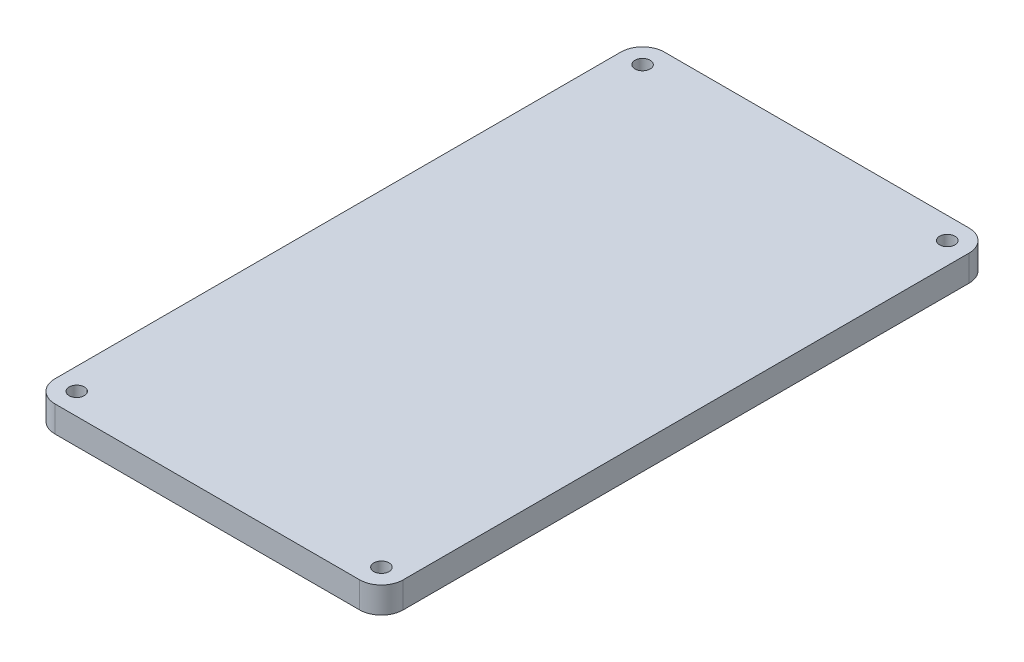
ISO-10303-21;
HEADER;
FILE_DESCRIPTION(('STEP AP214'),'2;1');
FILE_NAME('part.step','',(''),(''),'','','');
FILE_SCHEMA(('AUTOMOTIVE_DESIGN { 1 0 10303 214 1 1 1 1 }'));
ENDSEC;
DATA;
#1=APPLICATION_CONTEXT('core data for automotive mechanical design processes');
#2=APPLICATION_PROTOCOL_DEFINITION('international standard','automotive_design',2000,#1);
#3=PRODUCT_CONTEXT('',#1,'mechanical');
#4=PRODUCT('Part','Part','',(#3));
#5=PRODUCT_RELATED_PRODUCT_CATEGORY('part','',(#4));
#6=PRODUCT_DEFINITION_FORMATION('','',#4);
#7=PRODUCT_DEFINITION_CONTEXT('part definition',#1,'design');
#8=PRODUCT_DEFINITION('design','',#6,#7);
#9=PRODUCT_DEFINITION_SHAPE('','',#8);
#10=(LENGTH_UNIT() NAMED_UNIT(*) SI_UNIT(.MILLI.,.METRE.));
#11=(NAMED_UNIT(*) PLANE_ANGLE_UNIT() SI_UNIT($,.RADIAN.));
#12=(NAMED_UNIT(*) SI_UNIT($,.STERADIAN.) SOLID_ANGLE_UNIT());
#13=UNCERTAINTY_MEASURE_WITH_UNIT(LENGTH_MEASURE(1.E-05),#10,'distance_accuracy_value','');
#14=(GEOMETRIC_REPRESENTATION_CONTEXT(3) GLOBAL_UNCERTAINTY_ASSIGNED_CONTEXT((#13)) GLOBAL_UNIT_ASSIGNED_CONTEXT((#10,
#11,#12)) REPRESENTATION_CONTEXT('',''));
#15=CARTESIAN_POINT('',(0.,0.,0.));
#16=DIRECTION('',(0.,0.,1.));
#17=DIRECTION('',(1.,0.,0.));
#18=AXIS2_PLACEMENT_3D('',#15,#16,#17);
#19=CARTESIAN_POINT('',(40.,6.,-70.));
#20=DIRECTION('',(-1.,0.,0.));
#21=DIRECTION('',(0.,0.,1.));
#22=AXIS2_PLACEMENT_3D('',#19,#20,#21);
#23=PLANE('',#22);
#24=DIRECTION('',(0.,0.,-1.));
#25=VECTOR('',#24,1.);
#26=CARTESIAN_POINT('',(40.,0.,-70.));
#27=LINE('',#26,#25);
#28=CARTESIAN_POINT('',(40.,0.,65.));
#29=VERTEX_POINT('',#28);
#30=CARTESIAN_POINT('',(40.,0.,-65.));
#31=VERTEX_POINT('',#30);
#32=EDGE_CURVE('E130',#29,#31,#27,.T.);
#33=ORIENTED_EDGE('',*,*,#32,.T.);
#34=DIRECTION('',(0.,-1.,0.));
#35=VECTOR('',#34,1.);
#36=CARTESIAN_POINT('',(40.,6.,-65.));
#37=LINE('',#36,#35);
#38=CARTESIAN_POINT('',(40.,6.,-65.));
#39=VERTEX_POINT('',#38);
#40=EDGE_CURVE('E152',#31,#39,#37,.F.);
#41=ORIENTED_EDGE('',*,*,#40,.T.);
#42=DIRECTION('',(0.,0.,-1.));
#43=VECTOR('',#42,1.);
#44=CARTESIAN_POINT('',(40.,6.,-70.));
#45=LINE('',#44,#43);
#46=CARTESIAN_POINT('',(40.,6.,65.));
#47=VERTEX_POINT('',#46);
#48=EDGE_CURVE('E128',#47,#39,#45,.T.);
#49=ORIENTED_EDGE('',*,*,#48,.F.);
#50=DIRECTION('',(0.,-1.,0.));
#51=VECTOR('',#50,1.);
#52=CARTESIAN_POINT('',(40.,6.,65.));
#53=LINE('',#52,#51);
#54=EDGE_CURVE('E149',#47,#29,#53,.T.);
#55=ORIENTED_EDGE('',*,*,#54,.T.);
#56=EDGE_LOOP('',(#33,#41,#49,#55));
#57=FACE_BOUND('',#56,.T.);
#58=ADVANCED_FACE('F33',(#57),#23,.F.);
#59=CARTESIAN_POINT('',(-40.,6.,-70.));
#60=DIRECTION('',(0.,0.,1.));
#61=DIRECTION('',(1.,0.,0.));
#62=AXIS2_PLACEMENT_3D('',#59,#60,#61);
#63=PLANE('',#62);
#64=DIRECTION('',(-1.,0.,0.));
#65=VECTOR('',#64,1.);
#66=CARTESIAN_POINT('',(-40.,0.,-70.));
#67=LINE('',#66,#65);
#68=CARTESIAN_POINT('',(35.,0.,-70.));
#69=VERTEX_POINT('',#68);
#70=CARTESIAN_POINT('',(-35.,0.,-70.));
#71=VERTEX_POINT('',#70);
#72=EDGE_CURVE('E126',#69,#71,#67,.T.);
#73=ORIENTED_EDGE('',*,*,#72,.T.);
#74=DIRECTION('',(0.,-1.,0.));
#75=VECTOR('',#74,1.);
#76=CARTESIAN_POINT('',(-35.,6.,-70.));
#77=LINE('',#76,#75);
#78=CARTESIAN_POINT('',(-35.,6.,-70.));
#79=VERTEX_POINT('',#78);
#80=EDGE_CURVE('E104',#71,#79,#77,.F.);
#81=ORIENTED_EDGE('',*,*,#80,.T.);
#82=DIRECTION('',(-1.,0.,0.));
#83=VECTOR('',#82,1.);
#84=CARTESIAN_POINT('',(-40.,6.,-70.));
#85=LINE('',#84,#83);
#86=CARTESIAN_POINT('',(35.,6.,-70.));
#87=VERTEX_POINT('',#86);
#88=EDGE_CURVE('E166',#87,#79,#85,.T.);
#89=ORIENTED_EDGE('',*,*,#88,.F.);
#90=DIRECTION('',(0.,-1.,0.));
#91=VECTOR('',#90,1.);
#92=CARTESIAN_POINT('',(35.,6.,-70.));
#93=LINE('',#92,#91);
#94=EDGE_CURVE('E109',#87,#69,#93,.T.);
#95=ORIENTED_EDGE('',*,*,#94,.T.);
#96=EDGE_LOOP('',(#73,#81,#89,#95));
#97=FACE_BOUND('',#96,.T.);
#98=ADVANCED_FACE('F171',(#97),#63,.F.);
#99=CARTESIAN_POINT('',(-40.,6.,-70.));
#100=DIRECTION('',(1.,0.,0.));
#101=DIRECTION('',(0.,0.,-1.));
#102=AXIS2_PLACEMENT_3D('',#99,#100,#101);
#103=PLANE('',#102);
#104=DIRECTION('',(0.,0.,1.));
#105=VECTOR('',#104,1.);
#106=CARTESIAN_POINT('',(-40.,6.,-70.));
#107=LINE('',#106,#105);
#108=CARTESIAN_POINT('',(-40.,6.,-65.));
#109=VERTEX_POINT('',#108);
#110=CARTESIAN_POINT('',(-40.,6.,65.));
#111=VERTEX_POINT('',#110);
#112=EDGE_CURVE('E118',#109,#111,#107,.T.);
#113=ORIENTED_EDGE('',*,*,#112,.F.);
#114=DIRECTION('',(0.,-1.,0.));
#115=VECTOR('',#114,1.);
#116=CARTESIAN_POINT('',(-40.,6.,-65.));
#117=LINE('',#116,#115);
#118=CARTESIAN_POINT('',(-40.,0.,-65.));
#119=VERTEX_POINT('',#118);
#120=EDGE_CURVE('E103',#109,#119,#117,.T.);
#121=ORIENTED_EDGE('',*,*,#120,.T.);
#122=DIRECTION('',(0.,0.,1.));
#123=VECTOR('',#122,1.);
#124=CARTESIAN_POINT('',(-40.,0.,-70.));
#125=LINE('',#124,#123);
#126=CARTESIAN_POINT('',(-40.,0.,65.));
#127=VERTEX_POINT('',#126);
#128=EDGE_CURVE('E116',#119,#127,#125,.T.);
#129=ORIENTED_EDGE('',*,*,#128,.T.);
#130=DIRECTION('',(0.,-1.,0.));
#131=VECTOR('',#130,1.);
#132=CARTESIAN_POINT('',(-40.,6.,65.));
#133=LINE('',#132,#131);
#134=EDGE_CURVE('E120',#127,#111,#133,.F.);
#135=ORIENTED_EDGE('',*,*,#134,.T.);
#136=EDGE_LOOP('',(#113,#121,#129,#135));
#137=FACE_BOUND('',#136,.T.);
#138=ADVANCED_FACE('F115',(#137),#103,.F.);
#139=CARTESIAN_POINT('',(-40.,6.,70.));
#140=DIRECTION('',(0.,0.,-1.));
#141=DIRECTION('',(-1.,0.,0.));
#142=AXIS2_PLACEMENT_3D('',#139,#140,#141);
#143=PLANE('',#142);
#144=DIRECTION('',(1.,0.,0.));
#145=VECTOR('',#144,1.);
#146=CARTESIAN_POINT('',(-40.,6.,70.));
#147=LINE('',#146,#145);
#148=CARTESIAN_POINT('',(-35.,6.,70.));
#149=VERTEX_POINT('',#148);
#150=CARTESIAN_POINT('',(35.,6.,70.));
#151=VERTEX_POINT('',#150);
#152=EDGE_CURVE('E134',#149,#151,#147,.T.);
#153=ORIENTED_EDGE('',*,*,#152,.F.);
#154=DIRECTION('',(0.,-1.,0.));
#155=VECTOR('',#154,1.);
#156=CARTESIAN_POINT('',(-35.,6.,70.));
#157=LINE('',#156,#155);
#158=CARTESIAN_POINT('',(-35.,0.,70.));
#159=VERTEX_POINT('',#158);
#160=EDGE_CURVE('E11',#149,#159,#157,.T.);
#161=ORIENTED_EDGE('',*,*,#160,.T.);
#162=DIRECTION('',(1.,0.,0.));
#163=VECTOR('',#162,1.);
#164=CARTESIAN_POINT('',(-40.,0.,70.));
#165=LINE('',#164,#163);
#166=CARTESIAN_POINT('',(35.,0.,70.));
#167=VERTEX_POINT('',#166);
#168=EDGE_CURVE('E125',#159,#167,#165,.T.);
#169=ORIENTED_EDGE('',*,*,#168,.T.);
#170=DIRECTION('',(0.,-1.,0.));
#171=VECTOR('',#170,1.);
#172=CARTESIAN_POINT('',(35.,6.,70.));
#173=LINE('',#172,#171);
#174=EDGE_CURVE('E41',#167,#151,#173,.F.);
#175=ORIENTED_EDGE('',*,*,#174,.T.);
#176=EDGE_LOOP('',(#153,#161,#169,#175));
#177=FACE_BOUND('',#176,.T.);
#178=ADVANCED_FACE('F213',(#177),#143,.F.);
#179=CARTESIAN_POINT('',(0.,6.,0.));
#180=DIRECTION('',(0.,1.,0.));
#181=DIRECTION('',(0.,0.,1.));
#182=AXIS2_PLACEMENT_3D('',#179,#180,#181);
#183=PLANE('',#182);
#184=CARTESIAN_POINT('',(35.,6.,-65.));
#185=DIRECTION('',(0.,1.,0.));
#186=DIRECTION('',(0.,0.,1.));
#187=AXIS2_PLACEMENT_3D('',#184,#185,#186);
#188=CIRCLE('',#187,1.75);
#189=CARTESIAN_POINT('',(35.,6.,-63.25));
#190=VERTEX_POINT('',#189);
#191=EDGE_CURVE('E190',#190,#190,#188,.T.);
#192=ORIENTED_EDGE('',*,*,#191,.F.);
#193=EDGE_LOOP('',(#192));
#194=FACE_BOUND('',#193,.T.);
#195=CARTESIAN_POINT('',(-35.,6.,65.));
#196=DIRECTION('',(0.,1.,0.));
#197=DIRECTION('',(0.,0.,1.));
#198=AXIS2_PLACEMENT_3D('',#195,#196,#197);
#199=CIRCLE('',#198,1.75);
#200=CARTESIAN_POINT('',(-35.,6.,66.75));
#201=VERTEX_POINT('',#200);
#202=EDGE_CURVE('E183',#201,#201,#199,.T.);
#203=ORIENTED_EDGE('',*,*,#202,.F.);
#204=EDGE_LOOP('',(#203));
#205=FACE_BOUND('',#204,.T.);
#206=CARTESIAN_POINT('',(35.,6.,65.));
#207=DIRECTION('',(0.,1.,0.));
#208=DIRECTION('',(0.,0.,1.));
#209=AXIS2_PLACEMENT_3D('',#206,#207,#208);
#210=CIRCLE('',#209,1.75);
#211=CARTESIAN_POINT('',(35.,6.,66.75));
#212=VERTEX_POINT('',#211);
#213=EDGE_CURVE('E195',#212,#212,#210,.T.);
#214=ORIENTED_EDGE('',*,*,#213,.F.);
#215=EDGE_LOOP('',(#214));
#216=FACE_BOUND('',#215,.T.);
#217=CARTESIAN_POINT('',(-35.,6.,-65.));
#218=DIRECTION('',(0.,1.,0.));
#219=DIRECTION('',(0.,0.,1.));
#220=AXIS2_PLACEMENT_3D('',#217,#218,#219);
#221=CIRCLE('',#220,1.75);
#222=CARTESIAN_POINT('',(-35.,6.,-63.25));
#223=VERTEX_POINT('',#222);
#224=EDGE_CURVE('E174',#223,#223,#221,.T.);
#225=ORIENTED_EDGE('',*,*,#224,.F.);
#226=EDGE_LOOP('',(#225));
#227=FACE_BOUND('',#226,.T.);
#228=ORIENTED_EDGE('',*,*,#88,.T.);
#229=CARTESIAN_POINT('',(-35.,6.,-65.));
#230=DIRECTION('',(0.,1.,0.));
#231=DIRECTION('',(0.,0.,1.));
#232=AXIS2_PLACEMENT_3D('',#229,#230,#231);
#233=CIRCLE('',#232,5.);
#234=EDGE_CURVE('E147',#79,#109,#233,.T.);
#235=ORIENTED_EDGE('',*,*,#234,.T.);
#236=ORIENTED_EDGE('',*,*,#112,.T.);
#237=CARTESIAN_POINT('',(-35.,6.,65.));
#238=DIRECTION('',(0.,1.,0.));
#239=DIRECTION('',(0.,0.,1.));
#240=AXIS2_PLACEMENT_3D('',#237,#238,#239);
#241=CIRCLE('',#240,5.);
#242=EDGE_CURVE('E54',#111,#149,#241,.T.);
#243=ORIENTED_EDGE('',*,*,#242,.T.);
#244=ORIENTED_EDGE('',*,*,#152,.T.);
#245=CARTESIAN_POINT('',(35.,6.,65.));
#246=DIRECTION('',(0.,1.,0.));
#247=DIRECTION('',(0.,0.,1.));
#248=AXIS2_PLACEMENT_3D('',#245,#246,#247);
#249=CIRCLE('',#248,5.);
#250=EDGE_CURVE('E142',#151,#47,#249,.T.);
#251=ORIENTED_EDGE('',*,*,#250,.T.);
#252=ORIENTED_EDGE('',*,*,#48,.T.);
#253=CARTESIAN_POINT('',(35.,6.,-65.));
#254=DIRECTION('',(0.,1.,0.));
#255=DIRECTION('',(0.,0.,1.));
#256=AXIS2_PLACEMENT_3D('',#253,#254,#255);
#257=CIRCLE('',#256,5.);
#258=EDGE_CURVE('E145',#39,#87,#257,.T.);
#259=ORIENTED_EDGE('',*,*,#258,.T.);
#260=EDGE_LOOP('',(#228,#235,#236,#243,#244,#251,#252,#259));
#261=FACE_BOUND('',#260,.T.);
#262=ADVANCED_FACE('F163',(#194,#205,#216,#227,#261),#183,.T.);
#263=CARTESIAN_POINT('',(0.,0.,0.));
#264=DIRECTION('',(0.,1.,0.));
#265=DIRECTION('',(0.,0.,1.));
#266=AXIS2_PLACEMENT_3D('',#263,#264,#265);
#267=PLANE('',#266);
#268=CARTESIAN_POINT('',(35.,0.,-65.));
#269=DIRECTION('',(0.,1.,0.));
#270=DIRECTION('',(0.,0.,1.));
#271=AXIS2_PLACEMENT_3D('',#268,#269,#270);
#272=CIRCLE('',#271,1.75);
#273=CARTESIAN_POINT('',(35.,0.,-63.25));
#274=VERTEX_POINT('',#273);
#275=EDGE_CURVE('E181',#274,#274,#272,.T.);
#276=ORIENTED_EDGE('',*,*,#275,.T.);
#277=EDGE_LOOP('',(#276));
#278=FACE_BOUND('',#277,.T.);
#279=CARTESIAN_POINT('',(-35.,0.,65.));
#280=DIRECTION('',(0.,1.,0.));
#281=DIRECTION('',(0.,0.,1.));
#282=AXIS2_PLACEMENT_3D('',#279,#280,#281);
#283=CIRCLE('',#282,1.75);
#284=CARTESIAN_POINT('',(-35.,0.,66.75));
#285=VERTEX_POINT('',#284);
#286=EDGE_CURVE('E186',#285,#285,#283,.T.);
#287=ORIENTED_EDGE('',*,*,#286,.T.);
#288=EDGE_LOOP('',(#287));
#289=FACE_BOUND('',#288,.T.);
#290=CARTESIAN_POINT('',(35.,0.,65.));
#291=DIRECTION('',(0.,1.,0.));
#292=DIRECTION('',(0.,0.,1.));
#293=AXIS2_PLACEMENT_3D('',#290,#291,#292);
#294=CIRCLE('',#293,1.75);
#295=CARTESIAN_POINT('',(35.,0.,66.75));
#296=VERTEX_POINT('',#295);
#297=EDGE_CURVE('E187',#296,#296,#294,.T.);
#298=ORIENTED_EDGE('',*,*,#297,.T.);
#299=EDGE_LOOP('',(#298));
#300=FACE_BOUND('',#299,.T.);
#301=CARTESIAN_POINT('',(-35.,0.,-65.));
#302=DIRECTION('',(0.,1.,0.));
#303=DIRECTION('',(0.,0.,1.));
#304=AXIS2_PLACEMENT_3D('',#301,#302,#303);
#305=CIRCLE('',#304,1.75);
#306=CARTESIAN_POINT('',(-35.,0.,-63.25));
#307=VERTEX_POINT('',#306);
#308=EDGE_CURVE('E172',#307,#307,#305,.T.);
#309=ORIENTED_EDGE('',*,*,#308,.T.);
#310=EDGE_LOOP('',(#309));
#311=FACE_BOUND('',#310,.T.);
#312=ORIENTED_EDGE('',*,*,#128,.F.);
#313=CARTESIAN_POINT('',(-35.,0.,-65.));
#314=DIRECTION('',(0.,1.,0.));
#315=DIRECTION('',(0.,0.,1.));
#316=AXIS2_PLACEMENT_3D('',#313,#314,#315);
#317=CIRCLE('',#316,5.);
#318=EDGE_CURVE('E99',#119,#71,#317,.F.);
#319=ORIENTED_EDGE('',*,*,#318,.T.);
#320=ORIENTED_EDGE('',*,*,#72,.F.);
#321=CARTESIAN_POINT('',(35.,0.,-65.));
#322=DIRECTION('',(0.,1.,0.));
#323=DIRECTION('',(0.,0.,1.));
#324=AXIS2_PLACEMENT_3D('',#321,#322,#323);
#325=CIRCLE('',#324,5.);
#326=EDGE_CURVE('E110',#69,#31,#325,.F.);
#327=ORIENTED_EDGE('',*,*,#326,.T.);
#328=ORIENTED_EDGE('',*,*,#32,.F.);
#329=CARTESIAN_POINT('',(35.,0.,65.));
#330=DIRECTION('',(0.,1.,0.));
#331=DIRECTION('',(0.,0.,1.));
#332=AXIS2_PLACEMENT_3D('',#329,#330,#331);
#333=CIRCLE('',#332,5.);
#334=EDGE_CURVE('E119',#29,#167,#333,.F.);
#335=ORIENTED_EDGE('',*,*,#334,.T.);
#336=ORIENTED_EDGE('',*,*,#168,.F.);
#337=CARTESIAN_POINT('',(-35.,0.,65.));
#338=DIRECTION('',(0.,1.,0.));
#339=DIRECTION('',(0.,0.,1.));
#340=AXIS2_PLACEMENT_3D('',#337,#338,#339);
#341=CIRCLE('',#340,5.);
#342=EDGE_CURVE('E124',#159,#127,#341,.F.);
#343=ORIENTED_EDGE('',*,*,#342,.T.);
#344=EDGE_LOOP('',(#312,#319,#320,#327,#328,#335,#336,#343));
#345=FACE_BOUND('',#344,.T.);
#346=ADVANCED_FACE('F122',(#278,#289,#300,#311,#345),#267,.F.);
#347=CARTESIAN_POINT('',(-35.,0.,-65.));
#348=DIRECTION('',(0.,1.,0.));
#349=DIRECTION('',(0.,0.,1.));
#350=AXIS2_PLACEMENT_3D('',#347,#348,#349);
#351=CYLINDRICAL_SURFACE('',#350,1.75);
#352=ORIENTED_EDGE('',*,*,#308,.F.);
#353=EDGE_LOOP('',(#352));
#354=FACE_BOUND('',#353,.T.);
#355=ORIENTED_EDGE('',*,*,#224,.T.);
#356=EDGE_LOOP('',(#355));
#357=FACE_BOUND('',#356,.T.);
#358=ADVANCED_FACE('F207',(#354,#357),#351,.F.);
#359=CARTESIAN_POINT('',(35.,0.,65.));
#360=DIRECTION('',(0.,1.,0.));
#361=DIRECTION('',(0.,0.,1.));
#362=AXIS2_PLACEMENT_3D('',#359,#360,#361);
#363=CYLINDRICAL_SURFACE('',#362,1.75);
#364=ORIENTED_EDGE('',*,*,#297,.F.);
#365=EDGE_LOOP('',(#364));
#366=FACE_BOUND('',#365,.T.);
#367=ORIENTED_EDGE('',*,*,#213,.T.);
#368=EDGE_LOOP('',(#367));
#369=FACE_BOUND('',#368,.T.);
#370=ADVANCED_FACE('F203',(#366,#369),#363,.F.);
#371=CARTESIAN_POINT('',(-35.,0.,65.));
#372=DIRECTION('',(0.,1.,0.));
#373=DIRECTION('',(0.,0.,1.));
#374=AXIS2_PLACEMENT_3D('',#371,#372,#373);
#375=CYLINDRICAL_SURFACE('',#374,1.75);
#376=ORIENTED_EDGE('',*,*,#286,.F.);
#377=EDGE_LOOP('',(#376));
#378=FACE_BOUND('',#377,.T.);
#379=ORIENTED_EDGE('',*,*,#202,.T.);
#380=EDGE_LOOP('',(#379));
#381=FACE_BOUND('',#380,.T.);
#382=ADVANCED_FACE('F206',(#378,#381),#375,.F.);
#383=CARTESIAN_POINT('',(35.,0.,-65.));
#384=DIRECTION('',(0.,1.,0.));
#385=DIRECTION('',(0.,0.,1.));
#386=AXIS2_PLACEMENT_3D('',#383,#384,#385);
#387=CYLINDRICAL_SURFACE('',#386,1.75);
#388=ORIENTED_EDGE('',*,*,#275,.F.);
#389=EDGE_LOOP('',(#388));
#390=FACE_BOUND('',#389,.T.);
#391=ORIENTED_EDGE('',*,*,#191,.T.);
#392=EDGE_LOOP('',(#391));
#393=FACE_BOUND('',#392,.T.);
#394=ADVANCED_FACE('F238',(#390,#393),#387,.F.);
#395=CARTESIAN_POINT('',(-35.,6.,-65.));
#396=DIRECTION('',(0.,-1.,0.));
#397=DIRECTION('',(0.,0.,-1.));
#398=AXIS2_PLACEMENT_3D('',#395,#396,#397);
#399=CYLINDRICAL_SURFACE('',#398,5.);
#400=ORIENTED_EDGE('',*,*,#234,.F.);
#401=ORIENTED_EDGE('',*,*,#80,.F.);
#402=ORIENTED_EDGE('',*,*,#318,.F.);
#403=ORIENTED_EDGE('',*,*,#120,.F.);
#404=EDGE_LOOP('',(#400,#401,#402,#403));
#405=FACE_BOUND('',#404,.T.);
#406=ADVANCED_FACE('F102',(#405),#399,.T.);
#407=CARTESIAN_POINT('',(35.,6.,-65.));
#408=DIRECTION('',(0.,-1.,0.));
#409=DIRECTION('',(0.,0.,-1.));
#410=AXIS2_PLACEMENT_3D('',#407,#408,#409);
#411=CYLINDRICAL_SURFACE('',#410,5.);
#412=ORIENTED_EDGE('',*,*,#258,.F.);
#413=ORIENTED_EDGE('',*,*,#40,.F.);
#414=ORIENTED_EDGE('',*,*,#326,.F.);
#415=ORIENTED_EDGE('',*,*,#94,.F.);
#416=EDGE_LOOP('',(#412,#413,#414,#415));
#417=FACE_BOUND('',#416,.T.);
#418=ADVANCED_FACE('F169',(#417),#411,.T.);
#419=CARTESIAN_POINT('',(-35.,6.,65.));
#420=DIRECTION('',(0.,-1.,0.));
#421=DIRECTION('',(0.,0.,-1.));
#422=AXIS2_PLACEMENT_3D('',#419,#420,#421);
#423=CYLINDRICAL_SURFACE('',#422,5.);
#424=ORIENTED_EDGE('',*,*,#242,.F.);
#425=ORIENTED_EDGE('',*,*,#134,.F.);
#426=ORIENTED_EDGE('',*,*,#342,.F.);
#427=ORIENTED_EDGE('',*,*,#160,.F.);
#428=EDGE_LOOP('',(#424,#425,#426,#427));
#429=FACE_BOUND('',#428,.T.);
#430=ADVANCED_FACE('F240',(#429),#423,.T.);
#431=CARTESIAN_POINT('',(35.,6.,65.));
#432=DIRECTION('',(0.,-1.,0.));
#433=DIRECTION('',(0.,0.,-1.));
#434=AXIS2_PLACEMENT_3D('',#431,#432,#433);
#435=CYLINDRICAL_SURFACE('',#434,5.);
#436=ORIENTED_EDGE('',*,*,#250,.F.);
#437=ORIENTED_EDGE('',*,*,#174,.F.);
#438=ORIENTED_EDGE('',*,*,#334,.F.);
#439=ORIENTED_EDGE('',*,*,#54,.F.);
#440=EDGE_LOOP('',(#436,#437,#438,#439));
#441=FACE_BOUND('',#440,.T.);
#442=ADVANCED_FACE('F35',(#441),#435,.T.);
#443=CLOSED_SHELL('',(#58,#98,#138,#178,#262,#346,#358,#370,#382,#394,#406,#418,#430,#442));
#444=MANIFOLD_SOLID_BREP('B2',#443);
#445=ADVANCED_BREP_SHAPE_REPRESENTATION('',(#18,#444),#14);
#446=SHAPE_DEFINITION_REPRESENTATION(#9,#445);
ENDSEC;
END-ISO-10303-21;
